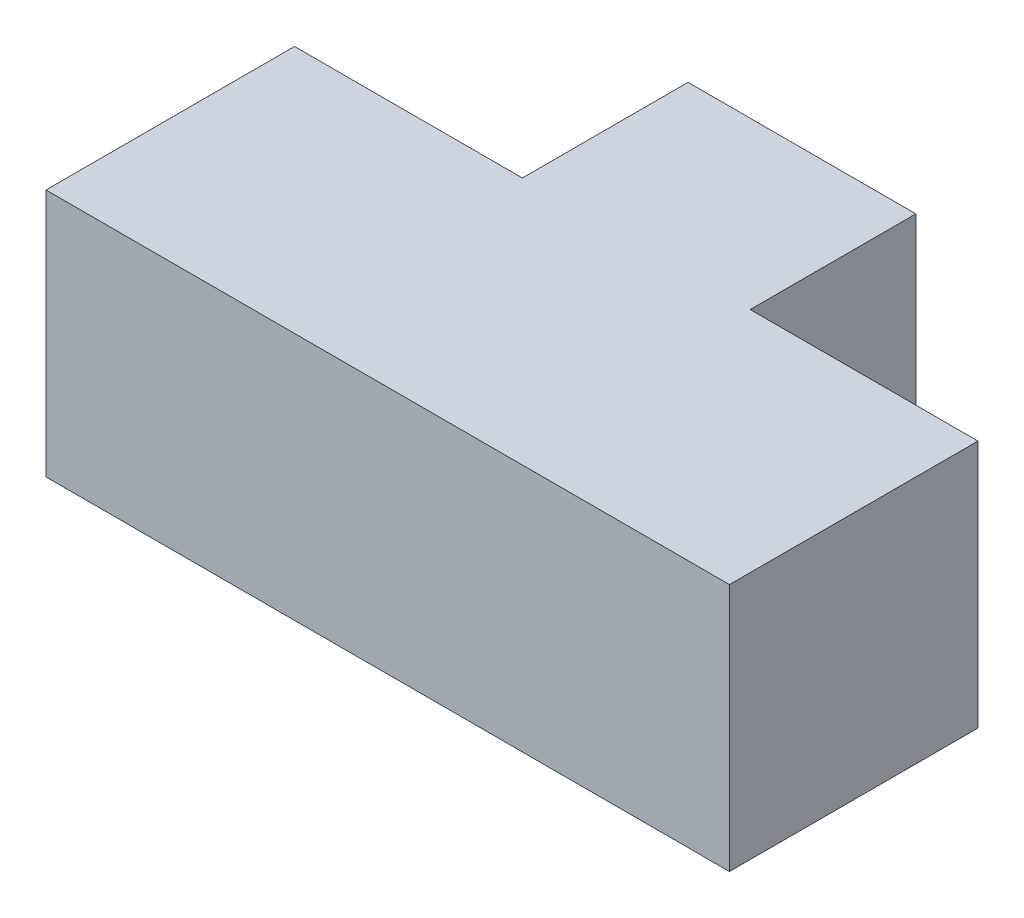
ISO-10303-21;
HEADER;
FILE_DESCRIPTION(('STEP AP214'),'2;1');
FILE_NAME('part.step','',(''),(''),'','','');
FILE_SCHEMA(('AUTOMOTIVE_DESIGN { 1 0 10303 214 1 1 1 1 }'));
ENDSEC;
DATA;
#1=APPLICATION_CONTEXT('core data for automotive mechanical design processes');
#2=APPLICATION_PROTOCOL_DEFINITION('international standard','automotive_design',2000,#1);
#3=PRODUCT_CONTEXT('',#1,'mechanical');
#4=PRODUCT('Part','Part','',(#3));
#5=PRODUCT_RELATED_PRODUCT_CATEGORY('part','',(#4));
#6=PRODUCT_DEFINITION_FORMATION('','',#4);
#7=PRODUCT_DEFINITION_CONTEXT('part definition',#1,'design');
#8=PRODUCT_DEFINITION('design','',#6,#7);
#9=PRODUCT_DEFINITION_SHAPE('','',#8);
#10=(LENGTH_UNIT() NAMED_UNIT(*) SI_UNIT(.MILLI.,.METRE.));
#11=(NAMED_UNIT(*) PLANE_ANGLE_UNIT() SI_UNIT($,.RADIAN.));
#12=(NAMED_UNIT(*) SI_UNIT($,.STERADIAN.) SOLID_ANGLE_UNIT());
#13=UNCERTAINTY_MEASURE_WITH_UNIT(LENGTH_MEASURE(1.E-05),#10,'distance_accuracy_value','');
#14=(GEOMETRIC_REPRESENTATION_CONTEXT(3) GLOBAL_UNCERTAINTY_ASSIGNED_CONTEXT((#13)) GLOBAL_UNIT_ASSIGNED_CONTEXT((#10,
#11,#12)) REPRESENTATION_CONTEXT('',''));
#15=CARTESIAN_POINT('',(0.,0.,0.));
#16=DIRECTION('',(0.,0.,1.));
#17=DIRECTION('',(1.,0.,0.));
#18=AXIS2_PLACEMENT_3D('',#15,#16,#17);
#19=CARTESIAN_POINT('',(0.,76.2,0.));
#20=DIRECTION('',(1.,0.,0.));
#21=DIRECTION('',(0.,0.,-1.));
#22=AXIS2_PLACEMENT_3D('',#19,#20,#21);
#23=PLANE('',#22);
#24=DIRECTION('',(0.,0.,1.));
#25=VECTOR('',#24,1.);
#26=CARTESIAN_POINT('',(0.,0.,0.));
#27=LINE('',#26,#25);
#28=CARTESIAN_POINT('',(0.,0.,-76.2));
#29=VERTEX_POINT('',#28);
#30=CARTESIAN_POINT('',(0.,0.,0.));
#31=VERTEX_POINT('',#30);
#32=EDGE_CURVE('E129',#29,#31,#27,.T.);
#33=ORIENTED_EDGE('',*,*,#32,.T.);
#34=DIRECTION('',(0.,-1.,0.));
#35=VECTOR('',#34,1.);
#36=CARTESIAN_POINT('',(0.,76.2,0.));
#37=LINE('',#36,#35);
#38=CARTESIAN_POINT('',(0.,76.2,0.));
#39=VERTEX_POINT('',#38);
#40=EDGE_CURVE('E11',#39,#31,#37,.T.);
#41=ORIENTED_EDGE('',*,*,#40,.F.);
#42=DIRECTION('',(0.,0.,1.));
#43=VECTOR('',#42,1.);
#44=CARTESIAN_POINT('',(0.,76.2,0.));
#45=LINE('',#44,#43);
#46=CARTESIAN_POINT('',(0.,76.2,-76.2));
#47=VERTEX_POINT('',#46);
#48=EDGE_CURVE('E143',#47,#39,#45,.T.);
#49=ORIENTED_EDGE('',*,*,#48,.F.);
#50=DIRECTION('',(0.,-1.,0.));
#51=VECTOR('',#50,1.);
#52=CARTESIAN_POINT('',(0.,76.2,-76.2));
#53=LINE('',#52,#51);
#54=EDGE_CURVE('E125',#47,#29,#53,.T.);
#55=ORIENTED_EDGE('',*,*,#54,.T.);
#56=EDGE_LOOP('',(#33,#41,#49,#55));
#57=FACE_BOUND('',#56,.T.);
#58=ADVANCED_FACE('F33',(#57),#23,.F.);
#59=CARTESIAN_POINT('',(0.,76.2,0.));
#60=DIRECTION('',(0.,0.,-1.));
#61=DIRECTION('',(-1.,0.,0.));
#62=AXIS2_PLACEMENT_3D('',#59,#60,#61);
#63=PLANE('',#62);
#64=DIRECTION('',(1.,0.,0.));
#65=VECTOR('',#64,1.);
#66=CARTESIAN_POINT('',(0.,0.,0.));
#67=LINE('',#66,#65);
#68=CARTESIAN_POINT('',(209.55,0.,0.));
#69=VERTEX_POINT('',#68);
#70=EDGE_CURVE('E132',#31,#69,#67,.T.);
#71=ORIENTED_EDGE('',*,*,#70,.T.);
#72=DIRECTION('',(0.,-1.,0.));
#73=VECTOR('',#72,1.);
#74=CARTESIAN_POINT('',(209.55,76.2,0.));
#75=LINE('',#74,#73);
#76=CARTESIAN_POINT('',(209.55,76.2,0.));
#77=VERTEX_POINT('',#76);
#78=EDGE_CURVE('E41',#77,#69,#75,.T.);
#79=ORIENTED_EDGE('',*,*,#78,.F.);
#80=DIRECTION('',(1.,0.,0.));
#81=VECTOR('',#80,1.);
#82=CARTESIAN_POINT('',(0.,76.2,0.));
#83=LINE('',#82,#81);
#84=EDGE_CURVE('E92',#39,#77,#83,.T.);
#85=ORIENTED_EDGE('',*,*,#84,.F.);
#86=ORIENTED_EDGE('',*,*,#40,.T.);
#87=EDGE_LOOP('',(#71,#79,#85,#86));
#88=FACE_BOUND('',#87,.T.);
#89=ADVANCED_FACE('F178',(#88),#63,.F.);
#90=CARTESIAN_POINT('',(209.55,76.2,-76.2));
#91=DIRECTION('',(-1.,0.,0.));
#92=DIRECTION('',(0.,0.,1.));
#93=AXIS2_PLACEMENT_3D('',#90,#91,#92);
#94=PLANE('',#93);
#95=DIRECTION('',(0.,0.,-1.));
#96=VECTOR('',#95,1.);
#97=CARTESIAN_POINT('',(209.55,0.,-76.2));
#98=LINE('',#97,#96);
#99=CARTESIAN_POINT('',(209.55,0.,-76.2));
#100=VERTEX_POINT('',#99);
#101=EDGE_CURVE('E134',#69,#100,#98,.T.);
#102=ORIENTED_EDGE('',*,*,#101,.T.);
#103=DIRECTION('',(0.,-1.,0.));
#104=VECTOR('',#103,1.);
#105=CARTESIAN_POINT('',(209.55,76.2,-76.2));
#106=LINE('',#105,#104);
#107=CARTESIAN_POINT('',(209.55,76.2,-76.2));
#108=VERTEX_POINT('',#107);
#109=EDGE_CURVE('E150',#108,#100,#106,.T.);
#110=ORIENTED_EDGE('',*,*,#109,.F.);
#111=DIRECTION('',(0.,0.,-1.));
#112=VECTOR('',#111,1.);
#113=CARTESIAN_POINT('',(209.55,76.2,-76.2));
#114=LINE('',#113,#112);
#115=EDGE_CURVE('E158',#77,#108,#114,.T.);
#116=ORIENTED_EDGE('',*,*,#115,.F.);
#117=ORIENTED_EDGE('',*,*,#78,.T.);
#118=EDGE_LOOP('',(#102,#110,#116,#117));
#119=FACE_BOUND('',#118,.T.);
#120=ADVANCED_FACE('F156',(#119),#94,.F.);
#121=CARTESIAN_POINT('',(139.7,76.2,-76.2));
#122=DIRECTION('',(0.,0.,1.));
#123=DIRECTION('',(1.,0.,0.));
#124=AXIS2_PLACEMENT_3D('',#121,#122,#123);
#125=PLANE('',#124);
#126=DIRECTION('',(-1.,0.,0.));
#127=VECTOR('',#126,1.);
#128=CARTESIAN_POINT('',(139.7,0.,-76.2));
#129=LINE('',#128,#127);
#130=CARTESIAN_POINT('',(139.7,0.,-76.2));
#131=VERTEX_POINT('',#130);
#132=EDGE_CURVE('E136',#100,#131,#129,.T.);
#133=ORIENTED_EDGE('',*,*,#132,.T.);
#134=DIRECTION('',(0.,-1.,0.));
#135=VECTOR('',#134,1.);
#136=CARTESIAN_POINT('',(139.7,76.2,-76.2));
#137=LINE('',#136,#135);
#138=CARTESIAN_POINT('',(139.7,76.2,-76.2));
#139=VERTEX_POINT('',#138);
#140=EDGE_CURVE('E147',#139,#131,#137,.T.);
#141=ORIENTED_EDGE('',*,*,#140,.F.);
#142=DIRECTION('',(-1.,0.,0.));
#143=VECTOR('',#142,1.);
#144=CARTESIAN_POINT('',(139.7,76.2,-76.2));
#145=LINE('',#144,#143);
#146=EDGE_CURVE('E170',#108,#139,#145,.T.);
#147=ORIENTED_EDGE('',*,*,#146,.F.);
#148=ORIENTED_EDGE('',*,*,#109,.T.);
#149=EDGE_LOOP('',(#133,#141,#147,#148));
#150=FACE_BOUND('',#149,.T.);
#151=ADVANCED_FACE('F166',(#150),#125,.F.);
#152=CARTESIAN_POINT('',(139.7,76.2,-127.));
#153=DIRECTION('',(-1.,0.,0.));
#154=DIRECTION('',(0.,0.,1.));
#155=AXIS2_PLACEMENT_3D('',#152,#153,#154);
#156=PLANE('',#155);
#157=DIRECTION('',(0.,0.,-1.));
#158=VECTOR('',#157,1.);
#159=CARTESIAN_POINT('',(139.7,0.,-127.));
#160=LINE('',#159,#158);
#161=CARTESIAN_POINT('',(139.7,0.,-127.));
#162=VERTEX_POINT('',#161);
#163=EDGE_CURVE('E138',#131,#162,#160,.T.);
#164=ORIENTED_EDGE('',*,*,#163,.T.);
#165=DIRECTION('',(0.,-1.,0.));
#166=VECTOR('',#165,1.);
#167=CARTESIAN_POINT('',(139.7,76.2,-127.));
#168=LINE('',#167,#166);
#169=CARTESIAN_POINT('',(139.7,76.2,-127.));
#170=VERTEX_POINT('',#169);
#171=EDGE_CURVE('E120',#170,#162,#168,.T.);
#172=ORIENTED_EDGE('',*,*,#171,.F.);
#173=DIRECTION('',(0.,0.,-1.));
#174=VECTOR('',#173,1.);
#175=CARTESIAN_POINT('',(139.7,76.2,-127.));
#176=LINE('',#175,#174);
#177=EDGE_CURVE('E111',#139,#170,#176,.T.);
#178=ORIENTED_EDGE('',*,*,#177,.F.);
#179=ORIENTED_EDGE('',*,*,#140,.T.);
#180=EDGE_LOOP('',(#164,#172,#178,#179));
#181=FACE_BOUND('',#180,.T.);
#182=ADVANCED_FACE('F169',(#181),#156,.F.);
#183=CARTESIAN_POINT('',(69.85,76.2,-127.));
#184=DIRECTION('',(0.,0.,1.));
#185=DIRECTION('',(1.,0.,0.));
#186=AXIS2_PLACEMENT_3D('',#183,#184,#185);
#187=PLANE('',#186);
#188=DIRECTION('',(-1.,0.,0.));
#189=VECTOR('',#188,1.);
#190=CARTESIAN_POINT('',(69.85,0.,-127.));
#191=LINE('',#190,#189);
#192=CARTESIAN_POINT('',(69.85,0.,-127.));
#193=VERTEX_POINT('',#192);
#194=EDGE_CURVE('E119',#162,#193,#191,.T.);
#195=ORIENTED_EDGE('',*,*,#194,.T.);
#196=DIRECTION('',(0.,-1.,0.));
#197=VECTOR('',#196,1.);
#198=CARTESIAN_POINT('',(69.85,76.2,-127.));
#199=LINE('',#198,#197);
#200=CARTESIAN_POINT('',(69.85,76.2,-127.));
#201=VERTEX_POINT('',#200);
#202=EDGE_CURVE('E116',#201,#193,#199,.T.);
#203=ORIENTED_EDGE('',*,*,#202,.F.);
#204=DIRECTION('',(-1.,0.,0.));
#205=VECTOR('',#204,1.);
#206=CARTESIAN_POINT('',(69.85,76.2,-127.));
#207=LINE('',#206,#205);
#208=EDGE_CURVE('E105',#170,#201,#207,.T.);
#209=ORIENTED_EDGE('',*,*,#208,.F.);
#210=ORIENTED_EDGE('',*,*,#171,.T.);
#211=EDGE_LOOP('',(#195,#203,#209,#210));
#212=FACE_BOUND('',#211,.T.);
#213=ADVANCED_FACE('F117',(#212),#187,.F.);
#214=CARTESIAN_POINT('',(69.85,76.2,-76.2));
#215=DIRECTION('',(1.,0.,0.));
#216=DIRECTION('',(0.,0.,-1.));
#217=AXIS2_PLACEMENT_3D('',#214,#215,#216);
#218=PLANE('',#217);
#219=DIRECTION('',(0.,0.,1.));
#220=VECTOR('',#219,1.);
#221=CARTESIAN_POINT('',(69.85,0.,-76.2));
#222=LINE('',#221,#220);
#223=CARTESIAN_POINT('',(69.85,0.,-76.2));
#224=VERTEX_POINT('',#223);
#225=EDGE_CURVE('E78',#193,#224,#222,.T.);
#226=ORIENTED_EDGE('',*,*,#225,.T.);
#227=DIRECTION('',(0.,-1.,0.));
#228=VECTOR('',#227,1.);
#229=CARTESIAN_POINT('',(69.85,76.2,-76.2));
#230=LINE('',#229,#228);
#231=CARTESIAN_POINT('',(69.85,76.2,-76.2));
#232=VERTEX_POINT('',#231);
#233=EDGE_CURVE('E121',#232,#224,#230,.T.);
#234=ORIENTED_EDGE('',*,*,#233,.F.);
#235=DIRECTION('',(0.,0.,1.));
#236=VECTOR('',#235,1.);
#237=CARTESIAN_POINT('',(69.85,76.2,-76.2));
#238=LINE('',#237,#236);
#239=EDGE_CURVE('E109',#201,#232,#238,.T.);
#240=ORIENTED_EDGE('',*,*,#239,.F.);
#241=ORIENTED_EDGE('',*,*,#202,.T.);
#242=EDGE_LOOP('',(#226,#234,#240,#241));
#243=FACE_BOUND('',#242,.T.);
#244=ADVANCED_FACE('F123',(#243),#218,.F.);
#245=CARTESIAN_POINT('',(0.,76.2,-76.2));
#246=DIRECTION('',(0.,0.,1.));
#247=DIRECTION('',(1.,0.,0.));
#248=AXIS2_PLACEMENT_3D('',#245,#246,#247);
#249=PLANE('',#248);
#250=DIRECTION('',(-1.,0.,0.));
#251=VECTOR('',#250,1.);
#252=CARTESIAN_POINT('',(0.,0.,-76.2));
#253=LINE('',#252,#251);
#254=EDGE_CURVE('E84',#224,#29,#253,.T.);
#255=ORIENTED_EDGE('',*,*,#254,.T.);
#256=ORIENTED_EDGE('',*,*,#54,.F.);
#257=DIRECTION('',(-1.,0.,0.));
#258=VECTOR('',#257,1.);
#259=CARTESIAN_POINT('',(0.,76.2,-76.2));
#260=LINE('',#259,#258);
#261=EDGE_CURVE('E49',#232,#47,#260,.T.);
#262=ORIENTED_EDGE('',*,*,#261,.F.);
#263=ORIENTED_EDGE('',*,*,#233,.T.);
#264=EDGE_LOOP('',(#255,#256,#262,#263));
#265=FACE_BOUND('',#264,.T.);
#266=ADVANCED_FACE('F194',(#265),#249,.F.);
#267=CARTESIAN_POINT('',(0.,76.2,0.));
#268=DIRECTION('',(0.,-1.,0.));
#269=DIRECTION('',(0.,0.,-1.));
#270=AXIS2_PLACEMENT_3D('',#267,#268,#269);
#271=PLANE('',#270);
#272=ORIENTED_EDGE('',*,*,#48,.T.);
#273=ORIENTED_EDGE('',*,*,#84,.T.);
#274=ORIENTED_EDGE('',*,*,#115,.T.);
#275=ORIENTED_EDGE('',*,*,#146,.T.);
#276=ORIENTED_EDGE('',*,*,#177,.T.);
#277=ORIENTED_EDGE('',*,*,#208,.T.);
#278=ORIENTED_EDGE('',*,*,#239,.T.);
#279=ORIENTED_EDGE('',*,*,#261,.T.);
#280=EDGE_LOOP('',(#272,#273,#274,#275,#276,#277,#278,#279));
#281=FACE_BOUND('',#280,.T.);
#282=ADVANCED_FACE('F107',(#281),#271,.F.);
#283=CARTESIAN_POINT('',(0.,0.,0.));
#284=DIRECTION('',(0.,-1.,0.));
#285=DIRECTION('',(0.,0.,-1.));
#286=AXIS2_PLACEMENT_3D('',#283,#284,#285);
#287=PLANE('',#286);
#288=ORIENTED_EDGE('',*,*,#32,.F.);
#289=ORIENTED_EDGE('',*,*,#254,.F.);
#290=ORIENTED_EDGE('',*,*,#225,.F.);
#291=ORIENTED_EDGE('',*,*,#194,.F.);
#292=ORIENTED_EDGE('',*,*,#163,.F.);
#293=ORIENTED_EDGE('',*,*,#132,.F.);
#294=ORIENTED_EDGE('',*,*,#101,.F.);
#295=ORIENTED_EDGE('',*,*,#70,.F.);
#296=EDGE_LOOP('',(#288,#289,#290,#291,#292,#293,#294,#295));
#297=FACE_BOUND('',#296,.T.);
#298=ADVANCED_FACE('F162',(#297),#287,.T.);
#299=CLOSED_SHELL('',(#58,#89,#120,#151,#182,#213,#244,#266,#282,#298));
#300=MANIFOLD_SOLID_BREP('B2',#299);
#301=ADVANCED_BREP_SHAPE_REPRESENTATION('',(#18,#300),#14);
#302=SHAPE_DEFINITION_REPRESENTATION(#9,#301);
ENDSEC;
END-ISO-10303-21;
